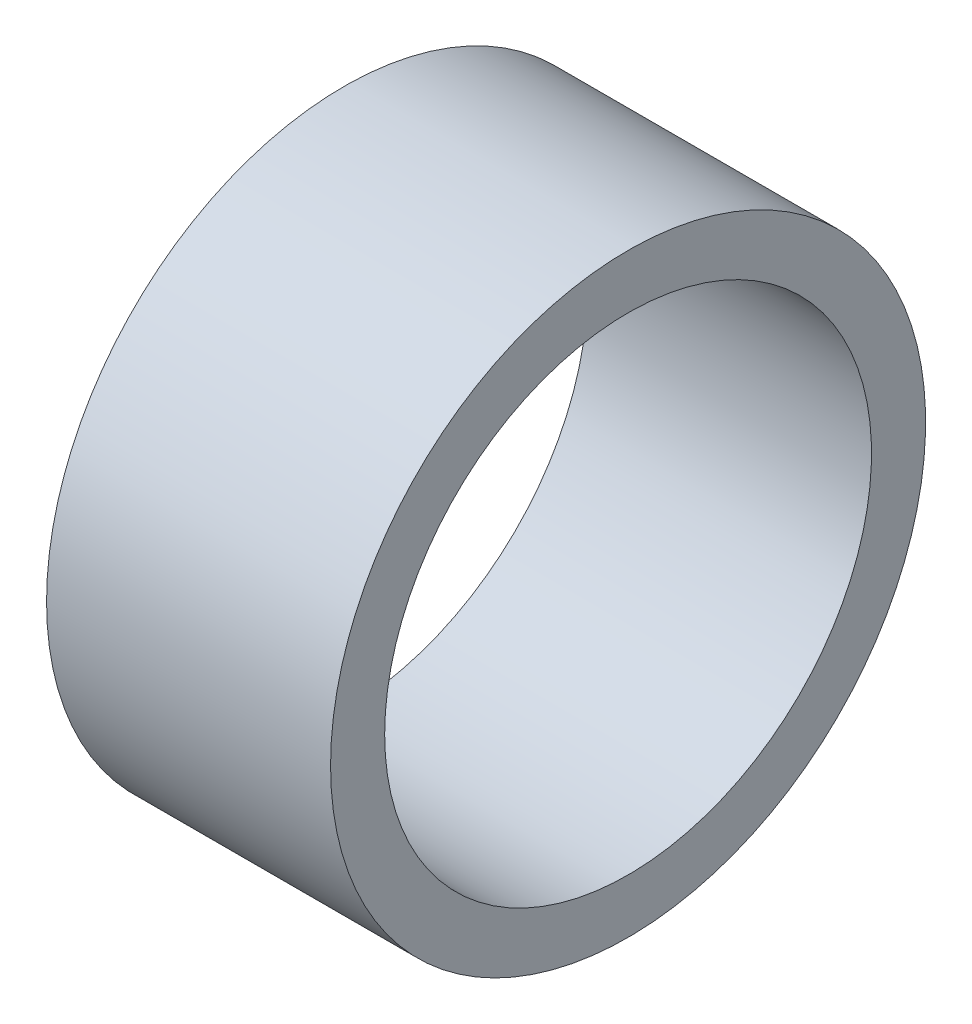
ISO-10303-21;
HEADER;
FILE_DESCRIPTION(('STEP AP214'),'2;1');
FILE_NAME('part.step','',(''),(''),'','','');
FILE_SCHEMA(('AUTOMOTIVE_DESIGN { 1 0 10303 214 1 1 1 1 }'));
ENDSEC;
DATA;
#1=APPLICATION_CONTEXT('core data for automotive mechanical design processes');
#2=APPLICATION_PROTOCOL_DEFINITION('international standard','automotive_design',2000,#1);
#3=PRODUCT_CONTEXT('',#1,'mechanical');
#4=PRODUCT('Part','Part','',(#3));
#5=PRODUCT_RELATED_PRODUCT_CATEGORY('part','',(#4));
#6=PRODUCT_DEFINITION_FORMATION('','',#4);
#7=PRODUCT_DEFINITION_CONTEXT('part definition',#1,'design');
#8=PRODUCT_DEFINITION('design','',#6,#7);
#9=PRODUCT_DEFINITION_SHAPE('','',#8);
#10=(LENGTH_UNIT() NAMED_UNIT(*) SI_UNIT(.MILLI.,.METRE.));
#11=(NAMED_UNIT(*) PLANE_ANGLE_UNIT() SI_UNIT($,.RADIAN.));
#12=(NAMED_UNIT(*) SI_UNIT($,.STERADIAN.) SOLID_ANGLE_UNIT());
#13=UNCERTAINTY_MEASURE_WITH_UNIT(LENGTH_MEASURE(1.E-05),#10,'distance_accuracy_value','');
#14=(GEOMETRIC_REPRESENTATION_CONTEXT(3) GLOBAL_UNCERTAINTY_ASSIGNED_CONTEXT((#13)) GLOBAL_UNIT_ASSIGNED_CONTEXT((#10,
#11,#12)) REPRESENTATION_CONTEXT('',''));
#15=CARTESIAN_POINT('',(0.,0.,0.));
#16=DIRECTION('',(0.,0.,1.));
#17=DIRECTION('',(1.,0.,0.));
#18=AXIS2_PLACEMENT_3D('',#15,#16,#17);
#19=CARTESIAN_POINT('',(21.,0.,0.));
#20=DIRECTION('',(-1.,0.,0.));
#21=DIRECTION('',(0.,0.,1.));
#22=AXIS2_PLACEMENT_3D('',#19,#20,#21);
#23=CYLINDRICAL_SURFACE('',#22,22.);
#24=CARTESIAN_POINT('',(21.,0.,0.));
#25=DIRECTION('',(-1.,0.,0.));
#26=DIRECTION('',(0.,0.,1.));
#27=AXIS2_PLACEMENT_3D('',#24,#25,#26);
#28=CIRCLE('',#27,22.);
#29=CARTESIAN_POINT('',(21.,0.,22.));
#30=VERTEX_POINT('',#29);
#31=EDGE_CURVE('E10',#30,#30,#28,.T.);
#32=ORIENTED_EDGE('',*,*,#31,.T.);
#33=EDGE_LOOP('',(#32));
#34=FACE_BOUND('',#33,.T.);
#35=CARTESIAN_POINT('',(0.,0.,0.));
#36=DIRECTION('',(-1.,0.,0.));
#37=DIRECTION('',(0.,0.,1.));
#38=AXIS2_PLACEMENT_3D('',#35,#36,#37);
#39=CIRCLE('',#38,22.);
#40=CARTESIAN_POINT('',(0.,0.,22.));
#41=VERTEX_POINT('',#40);
#42=EDGE_CURVE('E52',#41,#41,#39,.T.);
#43=ORIENTED_EDGE('',*,*,#42,.F.);
#44=EDGE_LOOP('',(#43));
#45=FACE_BOUND('',#44,.T.);
#46=ADVANCED_FACE('F38',(#34,#45),#23,.T.);
#47=CARTESIAN_POINT('',(21.,22.,0.));
#48=DIRECTION('',(1.,0.,0.));
#49=DIRECTION('',(0.,0.,-1.));
#50=AXIS2_PLACEMENT_3D('',#47,#48,#49);
#51=PLANE('',#50);
#52=CARTESIAN_POINT('',(21.,0.,0.));
#53=DIRECTION('',(-1.,0.,0.));
#54=DIRECTION('',(0.,0.,1.));
#55=AXIS2_PLACEMENT_3D('',#52,#53,#54);
#56=CIRCLE('',#55,18.);
#57=CARTESIAN_POINT('',(21.,0.,18.));
#58=VERTEX_POINT('',#57);
#59=EDGE_CURVE('E44',#58,#58,#56,.T.);
#60=ORIENTED_EDGE('',*,*,#59,.T.);
#61=EDGE_LOOP('',(#60));
#62=FACE_BOUND('',#61,.T.);
#63=ORIENTED_EDGE('',*,*,#31,.F.);
#64=EDGE_LOOP('',(#63));
#65=FACE_BOUND('',#64,.T.);
#66=ADVANCED_FACE('F62',(#62,#65),#51,.T.);
#67=CARTESIAN_POINT('',(21.,0.,0.));
#68=DIRECTION('',(-1.,0.,0.));
#69=DIRECTION('',(0.,0.,1.));
#70=AXIS2_PLACEMENT_3D('',#67,#68,#69);
#71=CYLINDRICAL_SURFACE('',#70,18.);
#72=CARTESIAN_POINT('',(0.,0.,0.));
#73=DIRECTION('',(-1.,0.,0.));
#74=DIRECTION('',(0.,0.,1.));
#75=AXIS2_PLACEMENT_3D('',#72,#73,#74);
#76=CIRCLE('',#75,18.);
#77=CARTESIAN_POINT('',(0.,0.,18.));
#78=VERTEX_POINT('',#77);
#79=EDGE_CURVE('E48',#78,#78,#76,.T.);
#80=ORIENTED_EDGE('',*,*,#79,.T.);
#81=EDGE_LOOP('',(#80));
#82=FACE_BOUND('',#81,.T.);
#83=ORIENTED_EDGE('',*,*,#59,.F.);
#84=EDGE_LOOP('',(#83));
#85=FACE_BOUND('',#84,.T.);
#86=ADVANCED_FACE('F66',(#82,#85),#71,.F.);
#87=CARTESIAN_POINT('',(0.,18.,0.));
#88=DIRECTION('',(-1.,0.,0.));
#89=DIRECTION('',(0.,0.,1.));
#90=AXIS2_PLACEMENT_3D('',#87,#88,#89);
#91=PLANE('',#90);
#92=ORIENTED_EDGE('',*,*,#42,.T.);
#93=EDGE_LOOP('',(#92));
#94=FACE_BOUND('',#93,.T.);
#95=ORIENTED_EDGE('',*,*,#79,.F.);
#96=EDGE_LOOP('',(#95));
#97=FACE_BOUND('',#96,.T.);
#98=ADVANCED_FACE('F58',(#94,#97),#91,.T.);
#99=CLOSED_SHELL('',(#46,#66,#86,#98));
#100=MANIFOLD_SOLID_BREP('B2',#99);
#101=ADVANCED_BREP_SHAPE_REPRESENTATION('',(#18,#100),#14);
#102=SHAPE_DEFINITION_REPRESENTATION(#9,#101);
ENDSEC;
END-ISO-10303-21;
